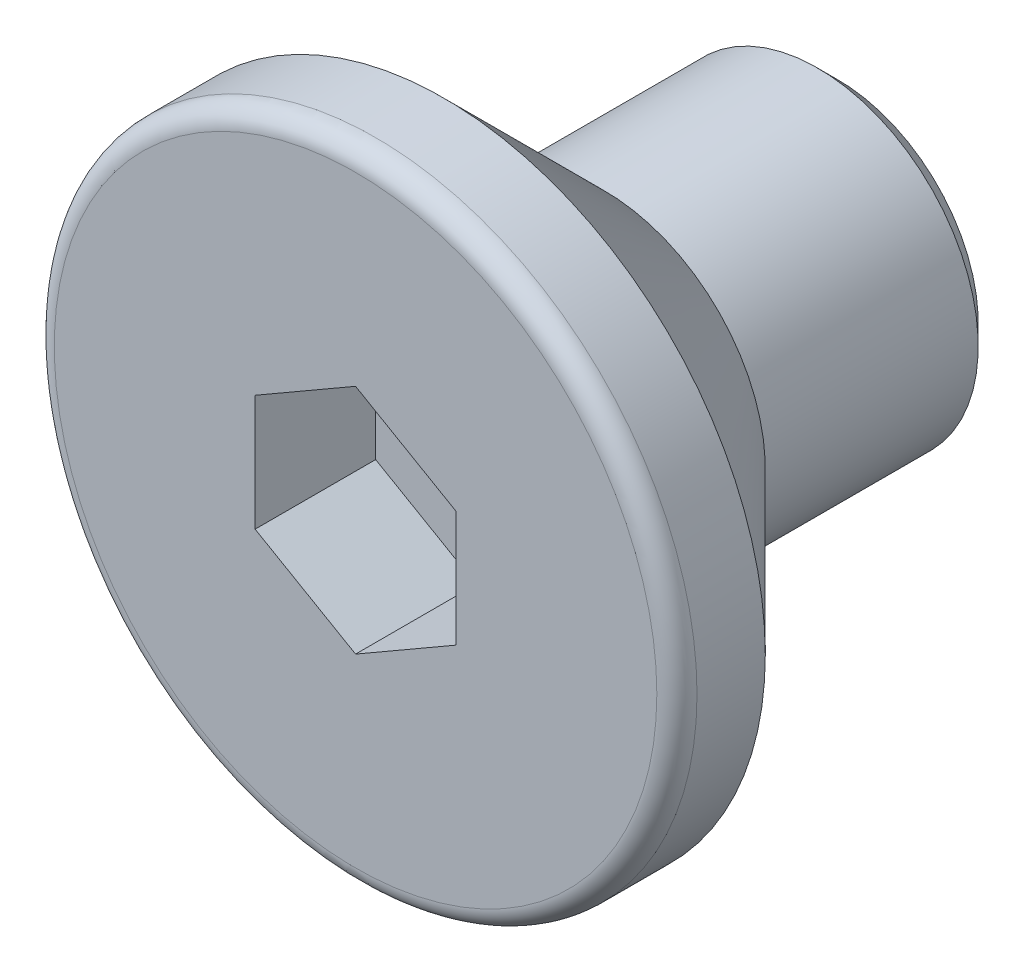
ISO-10303-21;
HEADER;
FILE_DESCRIPTION(('STEP AP214'),'2;1');
FILE_NAME('part.step','',(''),(''),'','','');
FILE_SCHEMA(('AUTOMOTIVE_DESIGN { 1 0 10303 214 1 1 1 1 }'));
ENDSEC;
DATA;
#1=APPLICATION_CONTEXT('core data for automotive mechanical design processes');
#2=APPLICATION_PROTOCOL_DEFINITION('international standard','automotive_design',2000,#1);
#3=PRODUCT_CONTEXT('',#1,'mechanical');
#4=PRODUCT('Part','Part','',(#3));
#5=PRODUCT_RELATED_PRODUCT_CATEGORY('part','',(#4));
#6=PRODUCT_DEFINITION_FORMATION('','',#4);
#7=PRODUCT_DEFINITION_CONTEXT('part definition',#1,'design');
#8=PRODUCT_DEFINITION('design','',#6,#7);
#9=PRODUCT_DEFINITION_SHAPE('','',#8);
#10=(LENGTH_UNIT() NAMED_UNIT(*) SI_UNIT(.MILLI.,.METRE.));
#11=(NAMED_UNIT(*) PLANE_ANGLE_UNIT() SI_UNIT($,.RADIAN.));
#12=(NAMED_UNIT(*) SI_UNIT($,.STERADIAN.) SOLID_ANGLE_UNIT());
#13=UNCERTAINTY_MEASURE_WITH_UNIT(LENGTH_MEASURE(1.E-05),#10,'distance_accuracy_value','');
#14=(GEOMETRIC_REPRESENTATION_CONTEXT(3) GLOBAL_UNCERTAINTY_ASSIGNED_CONTEXT((#13)) GLOBAL_UNIT_ASSIGNED_CONTEXT((#10,
#11,#12)) REPRESENTATION_CONTEXT('',''));
#15=CARTESIAN_POINT('',(0.,0.,0.));
#16=DIRECTION('',(0.,0.,1.));
#17=DIRECTION('',(1.,0.,0.));
#18=AXIS2_PLACEMENT_3D('',#15,#16,#17);
#19=CARTESIAN_POINT('',(0.,0.,6.));
#20=DIRECTION('',(0.,0.,1.));
#21=DIRECTION('',(1.,0.,0.));
#22=AXIS2_PLACEMENT_3D('',#19,#20,#21);
#23=PLANE('',#22);
#24=CARTESIAN_POINT('',(0.,0.,6.));
#25=DIRECTION('',(0.,0.,1.));
#26=DIRECTION('',(1.,0.,0.));
#27=AXIS2_PLACEMENT_3D('',#24,#25,#26);
#28=CIRCLE('',#27,7.5);
#29=CARTESIAN_POINT('',(7.5,0.,6.));
#30=VERTEX_POINT('',#29);
#31=EDGE_CURVE('E154',#30,#30,#28,.T.);
#32=ORIENTED_EDGE('',*,*,#31,.T.);
#33=EDGE_LOOP('',(#32));
#34=FACE_BOUND('',#33,.T.);
#35=DIRECTION('',(-0.866025403784439,0.5,0.));
#36=VECTOR('',#35,1.);
#37=CARTESIAN_POINT('',(2.5,1.44337567297407,6.));
#38=LINE('',#37,#36);
#39=CARTESIAN_POINT('',(2.5,1.44337567297407,6.));
#40=VERTEX_POINT('',#39);
#41=CARTESIAN_POINT('',(0.,2.88675134594813,6.));
#42=VERTEX_POINT('',#41);
#43=EDGE_CURVE('E53',#40,#42,#38,.T.);
#44=ORIENTED_EDGE('',*,*,#43,.F.);
#45=DIRECTION('',(0.,1.,0.));
#46=VECTOR('',#45,1.);
#47=CARTESIAN_POINT('',(2.5,-1.44337567297406,6.));
#48=LINE('',#47,#46);
#49=CARTESIAN_POINT('',(2.5,-1.44337567297406,6.));
#50=VERTEX_POINT('',#49);
#51=EDGE_CURVE('E136',#50,#40,#48,.T.);
#52=ORIENTED_EDGE('',*,*,#51,.F.);
#53=DIRECTION('',(0.866025403784439,0.5,0.));
#54=VECTOR('',#53,1.);
#55=CARTESIAN_POINT('',(0.,-2.88675134594813,6.));
#56=LINE('',#55,#54);
#57=CARTESIAN_POINT('',(0.,-2.88675134594813,6.));
#58=VERTEX_POINT('',#57);
#59=EDGE_CURVE('E134',#58,#50,#56,.T.);
#60=ORIENTED_EDGE('',*,*,#59,.F.);
#61=DIRECTION('',(0.866025403784439,-0.5,0.));
#62=VECTOR('',#61,1.);
#63=CARTESIAN_POINT('',(-2.5,-1.44337567297406,6.));
#64=LINE('',#63,#62);
#65=CARTESIAN_POINT('',(-2.5,-1.44337567297406,6.));
#66=VERTEX_POINT('',#65);
#67=EDGE_CURVE('E101',#66,#58,#64,.T.);
#68=ORIENTED_EDGE('',*,*,#67,.F.);
#69=DIRECTION('',(0.,-1.,0.));
#70=VECTOR('',#69,1.);
#71=CARTESIAN_POINT('',(-2.5,1.44337567297407,6.));
#72=LINE('',#71,#70);
#73=CARTESIAN_POINT('',(-2.5,1.44337567297407,6.));
#74=VERTEX_POINT('',#73);
#75=EDGE_CURVE('E130',#74,#66,#72,.T.);
#76=ORIENTED_EDGE('',*,*,#75,.F.);
#77=DIRECTION('',(-0.866025403784439,-0.5,0.));
#78=VECTOR('',#77,1.);
#79=CARTESIAN_POINT('',(0.,2.88675134594813,6.));
#80=LINE('',#79,#78);
#81=EDGE_CURVE('E127',#42,#74,#80,.T.);
#82=ORIENTED_EDGE('',*,*,#81,.F.);
#83=EDGE_LOOP('',(#44,#52,#60,#68,#76,#82));
#84=FACE_BOUND('',#83,.T.);
#85=ADVANCED_FACE('F37',(#34,#84),#23,.T.);
#86=CARTESIAN_POINT('',(0.,0.,-6.));
#87=DIRECTION('',(0.,0.,-1.));
#88=DIRECTION('',(-1.,0.,0.));
#89=AXIS2_PLACEMENT_3D('',#86,#87,#88);
#90=CYLINDRICAL_SURFACE('',#89,8.);
#91=CARTESIAN_POINT('',(0.,0.,5.5));
#92=DIRECTION('',(0.,0.,1.));
#93=DIRECTION('',(1.,0.,0.));
#94=AXIS2_PLACEMENT_3D('',#91,#92,#93);
#95=CIRCLE('',#94,8.);
#96=CARTESIAN_POINT('',(8.,0.,5.5));
#97=VERTEX_POINT('',#96);
#98=EDGE_CURVE('E151',#97,#97,#95,.F.);
#99=ORIENTED_EDGE('',*,*,#98,.T.);
#100=EDGE_LOOP('',(#99));
#101=FACE_BOUND('',#100,.T.);
#102=CARTESIAN_POINT('',(0.,0.,3.79999999999999));
#103=DIRECTION('',(0.,0.,-1.));
#104=DIRECTION('',(-1.,0.,0.));
#105=AXIS2_PLACEMENT_3D('',#102,#103,#104);
#106=CIRCLE('',#105,8.);
#107=CARTESIAN_POINT('',(-8.,0.,3.79999999999999));
#108=VERTEX_POINT('',#107);
#109=EDGE_CURVE('E148',#108,#108,#106,.T.);
#110=ORIENTED_EDGE('',*,*,#109,.F.);
#111=EDGE_LOOP('',(#110));
#112=FACE_BOUND('',#111,.T.);
#113=ADVANCED_FACE('F170',(#101,#112),#90,.T.);
#114=CARTESIAN_POINT('',(0.,0.,-0.2));
#115=DIRECTION('',(0.,0.,1.));
#116=DIRECTION('',(1.,0.,0.));
#117=AXIS2_PLACEMENT_3D('',#114,#115,#116);
#118=CONICAL_SURFACE('',#117,4.,0.78539816339745);
#119=ORIENTED_EDGE('',*,*,#109,.T.);
#120=EDGE_LOOP('',(#119));
#121=FACE_BOUND('',#120,.T.);
#122=CARTESIAN_POINT('',(0.,0.,-0.2));
#123=DIRECTION('',(0.,0.,-1.));
#124=DIRECTION('',(-1.,0.,0.));
#125=AXIS2_PLACEMENT_3D('',#122,#123,#124);
#126=CIRCLE('',#125,4.);
#127=CARTESIAN_POINT('',(-4.,0.,-0.2));
#128=VERTEX_POINT('',#127);
#129=EDGE_CURVE('E140',#128,#128,#126,.T.);
#130=ORIENTED_EDGE('',*,*,#129,.F.);
#131=EDGE_LOOP('',(#130));
#132=FACE_BOUND('',#131,.T.);
#133=ADVANCED_FACE('F176',(#121,#132),#118,.T.);
#134=CARTESIAN_POINT('',(0.,0.,-6.));
#135=DIRECTION('',(0.,0.,-1.));
#136=DIRECTION('',(-1.,0.,0.));
#137=AXIS2_PLACEMENT_3D('',#134,#135,#136);
#138=CYLINDRICAL_SURFACE('',#137,4.);
#139=CARTESIAN_POINT('',(0.,0.,-5.5));
#140=DIRECTION('',(0.,0.,-1.));
#141=DIRECTION('',(-1.,0.,0.));
#142=AXIS2_PLACEMENT_3D('',#139,#140,#141);
#143=CIRCLE('',#142,4.);
#144=CARTESIAN_POINT('',(-4.,0.,-5.5));
#145=VERTEX_POINT('',#144);
#146=EDGE_CURVE('E11',#145,#145,#143,.F.);
#147=ORIENTED_EDGE('',*,*,#146,.T.);
#148=EDGE_LOOP('',(#147));
#149=FACE_BOUND('',#148,.T.);
#150=ORIENTED_EDGE('',*,*,#129,.T.);
#151=EDGE_LOOP('',(#150));
#152=FACE_BOUND('',#151,.T.);
#153=ADVANCED_FACE('F183',(#149,#152),#138,.T.);
#154=CARTESIAN_POINT('',(0.,4.,-6.));
#155=DIRECTION('',(0.,0.,-1.));
#156=DIRECTION('',(-1.,0.,0.));
#157=AXIS2_PLACEMENT_3D('',#154,#155,#156);
#158=PLANE('',#157);
#159=CARTESIAN_POINT('',(0.,0.,-6.));
#160=DIRECTION('',(0.,0.,-1.));
#161=DIRECTION('',(-1.,0.,0.));
#162=AXIS2_PLACEMENT_3D('',#159,#160,#161);
#163=CIRCLE('',#162,3.5);
#164=CARTESIAN_POINT('',(-3.5,0.,-6.));
#165=VERTEX_POINT('',#164);
#166=EDGE_CURVE('E46',#165,#165,#163,.T.);
#167=ORIENTED_EDGE('',*,*,#166,.T.);
#168=EDGE_LOOP('',(#167));
#169=FACE_BOUND('',#168,.T.);
#170=ADVANCED_FACE('F159',(#169),#158,.T.);
#171=CARTESIAN_POINT('',(2.5,1.44337567297407,3.));
#172=DIRECTION('',(0.5,0.866025403784439,0.));
#173=DIRECTION('',(-0.866025403784439,0.5,0.));
#174=AXIS2_PLACEMENT_3D('',#171,#172,#173);
#175=PLANE('',#174);
#176=ORIENTED_EDGE('',*,*,#43,.T.);
#177=DIRECTION('',(0.,0.,1.));
#178=VECTOR('',#177,1.);
#179=CARTESIAN_POINT('',(0.,2.88675134594813,3.));
#180=LINE('',#179,#178);
#181=CARTESIAN_POINT('',(0.,2.88675134594813,3.));
#182=VERTEX_POINT('',#181);
#183=EDGE_CURVE('E83',#182,#42,#180,.T.);
#184=ORIENTED_EDGE('',*,*,#183,.F.);
#185=DIRECTION('',(-0.866025403784439,0.5,0.));
#186=VECTOR('',#185,1.);
#187=CARTESIAN_POINT('',(2.5,1.44337567297407,3.));
#188=LINE('',#187,#186);
#189=CARTESIAN_POINT('',(2.5,1.44337567297407,3.));
#190=VERTEX_POINT('',#189);
#191=EDGE_CURVE('E138',#190,#182,#188,.T.);
#192=ORIENTED_EDGE('',*,*,#191,.F.);
#193=DIRECTION('',(0.,0.,1.));
#194=VECTOR('',#193,1.);
#195=CARTESIAN_POINT('',(2.5,1.44337567297407,3.));
#196=LINE('',#195,#194);
#197=EDGE_CURVE('E61',#190,#40,#196,.T.);
#198=ORIENTED_EDGE('',*,*,#197,.T.);
#199=EDGE_LOOP('',(#176,#184,#192,#198));
#200=FACE_BOUND('',#199,.T.);
#201=ADVANCED_FACE('F190',(#200),#175,.F.);
#202=CARTESIAN_POINT('',(2.5,-1.44337567297406,3.));
#203=DIRECTION('',(1.,0.,0.));
#204=DIRECTION('',(0.,1.,0.));
#205=AXIS2_PLACEMENT_3D('',#202,#203,#204);
#206=PLANE('',#205);
#207=ORIENTED_EDGE('',*,*,#51,.T.);
#208=ORIENTED_EDGE('',*,*,#197,.F.);
#209=DIRECTION('',(0.,1.,0.));
#210=VECTOR('',#209,1.);
#211=CARTESIAN_POINT('',(2.5,-1.44337567297406,3.));
#212=LINE('',#211,#210);
#213=CARTESIAN_POINT('',(2.5,-1.44337567297406,3.));
#214=VERTEX_POINT('',#213);
#215=EDGE_CURVE('E113',#214,#190,#212,.T.);
#216=ORIENTED_EDGE('',*,*,#215,.F.);
#217=DIRECTION('',(0.,0.,1.));
#218=VECTOR('',#217,1.);
#219=CARTESIAN_POINT('',(2.5,-1.44337567297406,3.));
#220=LINE('',#219,#218);
#221=EDGE_CURVE('E105',#214,#50,#220,.T.);
#222=ORIENTED_EDGE('',*,*,#221,.T.);
#223=EDGE_LOOP('',(#207,#208,#216,#222));
#224=FACE_BOUND('',#223,.T.);
#225=ADVANCED_FACE('F193',(#224),#206,.F.);
#226=CARTESIAN_POINT('',(0.,-2.88675134594813,3.));
#227=DIRECTION('',(0.5,-0.866025403784439,0.));
#228=DIRECTION('',(0.866025403784439,0.5,0.));
#229=AXIS2_PLACEMENT_3D('',#226,#227,#228);
#230=PLANE('',#229);
#231=ORIENTED_EDGE('',*,*,#59,.T.);
#232=ORIENTED_EDGE('',*,*,#221,.F.);
#233=DIRECTION('',(0.866025403784439,0.5,0.));
#234=VECTOR('',#233,1.);
#235=CARTESIAN_POINT('',(0.,-2.88675134594813,3.));
#236=LINE('',#235,#234);
#237=CARTESIAN_POINT('',(0.,-2.88675134594813,3.));
#238=VERTEX_POINT('',#237);
#239=EDGE_CURVE('E109',#238,#214,#236,.T.);
#240=ORIENTED_EDGE('',*,*,#239,.F.);
#241=DIRECTION('',(0.,0.,1.));
#242=VECTOR('',#241,1.);
#243=CARTESIAN_POINT('',(0.,-2.88675134594813,3.));
#244=LINE('',#243,#242);
#245=EDGE_CURVE('E94',#238,#58,#244,.T.);
#246=ORIENTED_EDGE('',*,*,#245,.T.);
#247=EDGE_LOOP('',(#231,#232,#240,#246));
#248=FACE_BOUND('',#247,.T.);
#249=ADVANCED_FACE('F110',(#248),#230,.F.);
#250=CARTESIAN_POINT('',(-2.5,-1.44337567297406,3.));
#251=DIRECTION('',(-0.5,-0.866025403784438,0.));
#252=DIRECTION('',(0.866025403784439,-0.5,0.));
#253=AXIS2_PLACEMENT_3D('',#250,#251,#252);
#254=PLANE('',#253);
#255=ORIENTED_EDGE('',*,*,#67,.T.);
#256=ORIENTED_EDGE('',*,*,#245,.F.);
#257=DIRECTION('',(0.866025403784439,-0.5,0.));
#258=VECTOR('',#257,1.);
#259=CARTESIAN_POINT('',(-2.5,-1.44337567297406,3.));
#260=LINE('',#259,#258);
#261=CARTESIAN_POINT('',(-2.5,-1.44337567297406,3.));
#262=VERTEX_POINT('',#261);
#263=EDGE_CURVE('E98',#262,#238,#260,.T.);
#264=ORIENTED_EDGE('',*,*,#263,.F.);
#265=DIRECTION('',(0.,0.,1.));
#266=VECTOR('',#265,1.);
#267=CARTESIAN_POINT('',(-2.5,-1.44337567297406,3.));
#268=LINE('',#267,#266);
#269=EDGE_CURVE('E106',#262,#66,#268,.T.);
#270=ORIENTED_EDGE('',*,*,#269,.T.);
#271=EDGE_LOOP('',(#255,#256,#264,#270));
#272=FACE_BOUND('',#271,.T.);
#273=ADVANCED_FACE('F96',(#272),#254,.F.);
#274=CARTESIAN_POINT('',(-2.5,1.44337567297407,3.));
#275=DIRECTION('',(-1.,0.,0.));
#276=DIRECTION('',(0.,0.,1.));
#277=AXIS2_PLACEMENT_3D('',#274,#275,#276);
#278=PLANE('',#277);
#279=ORIENTED_EDGE('',*,*,#75,.T.);
#280=ORIENTED_EDGE('',*,*,#269,.F.);
#281=DIRECTION('',(0.,-1.,0.));
#282=VECTOR('',#281,1.);
#283=CARTESIAN_POINT('',(-2.5,1.44337567297407,3.));
#284=LINE('',#283,#282);
#285=CARTESIAN_POINT('',(-2.5,1.44337567297407,3.));
#286=VERTEX_POINT('',#285);
#287=EDGE_CURVE('E119',#286,#262,#284,.T.);
#288=ORIENTED_EDGE('',*,*,#287,.F.);
#289=DIRECTION('',(0.,0.,1.));
#290=VECTOR('',#289,1.);
#291=CARTESIAN_POINT('',(-2.5,1.44337567297407,3.));
#292=LINE('',#291,#290);
#293=EDGE_CURVE('E143',#286,#74,#292,.T.);
#294=ORIENTED_EDGE('',*,*,#293,.T.);
#295=EDGE_LOOP('',(#279,#280,#288,#294));
#296=FACE_BOUND('',#295,.T.);
#297=ADVANCED_FACE('F197',(#296),#278,.F.);
#298=CARTESIAN_POINT('',(0.,2.88675134594813,3.));
#299=DIRECTION('',(-0.5,0.866025403784439,0.));
#300=DIRECTION('',(-0.866025403784439,-0.5,0.));
#301=AXIS2_PLACEMENT_3D('',#298,#299,#300);
#302=PLANE('',#301);
#303=ORIENTED_EDGE('',*,*,#81,.T.);
#304=ORIENTED_EDGE('',*,*,#293,.F.);
#305=DIRECTION('',(-0.866025403784439,-0.5,0.));
#306=VECTOR('',#305,1.);
#307=CARTESIAN_POINT('',(0.,2.88675134594813,3.));
#308=LINE('',#307,#306);
#309=EDGE_CURVE('E121',#182,#286,#308,.T.);
#310=ORIENTED_EDGE('',*,*,#309,.F.);
#311=ORIENTED_EDGE('',*,*,#183,.T.);
#312=EDGE_LOOP('',(#303,#304,#310,#311));
#313=FACE_BOUND('',#312,.T.);
#314=ADVANCED_FACE('F194',(#313),#302,.F.);
#315=CARTESIAN_POINT('',(0.,0.,3.));
#316=DIRECTION('',(0.,0.,1.));
#317=DIRECTION('',(1.,0.,0.));
#318=AXIS2_PLACEMENT_3D('',#315,#316,#317);
#319=PLANE('',#318);
#320=ORIENTED_EDGE('',*,*,#191,.T.);
#321=ORIENTED_EDGE('',*,*,#309,.T.);
#322=ORIENTED_EDGE('',*,*,#287,.T.);
#323=ORIENTED_EDGE('',*,*,#263,.T.);
#324=ORIENTED_EDGE('',*,*,#239,.T.);
#325=ORIENTED_EDGE('',*,*,#215,.T.);
#326=EDGE_LOOP('',(#320,#321,#322,#323,#324,#325));
#327=FACE_BOUND('',#326,.T.);
#328=ADVANCED_FACE('F116',(#327),#319,.T.);
#329=CARTESIAN_POINT('',(0.,0.,5.5));
#330=DIRECTION('',(0.,0.,1.));
#331=DIRECTION('',(1.,0.,0.));
#332=AXIS2_PLACEMENT_3D('',#329,#330,#331);
#333=TOROIDAL_SURFACE('',#332,7.5,0.5);
#334=ORIENTED_EDGE('',*,*,#31,.F.);
#335=EDGE_LOOP('',(#334));
#336=FACE_BOUND('',#335,.T.);
#337=ORIENTED_EDGE('',*,*,#98,.F.);
#338=EDGE_LOOP('',(#337));
#339=FACE_BOUND('',#338,.T.);
#340=ADVANCED_FACE('F162',(#336,#339),#333,.T.);
#341=CARTESIAN_POINT('',(0.,0.,-6.));
#342=DIRECTION('',(0.,0.,1.));
#343=DIRECTION('',(1.,0.,0.));
#344=AXIS2_PLACEMENT_3D('',#341,#342,#343);
#345=CONICAL_SURFACE('',#344,3.5,0.785398163397445);
#346=ORIENTED_EDGE('',*,*,#146,.F.);
#347=EDGE_LOOP('',(#346));
#348=FACE_BOUND('',#347,.T.);
#349=ORIENTED_EDGE('',*,*,#166,.F.);
#350=EDGE_LOOP('',(#349));
#351=FACE_BOUND('',#350,.T.);
#352=ADVANCED_FACE('F40',(#348,#351),#345,.T.);
#353=CLOSED_SHELL('',(#85,#113,#133,#153,#170,#201,#225,#249,#273,#297,#314,#328,#340,#352));
#354=MANIFOLD_SOLID_BREP('B2',#353);
#355=ADVANCED_BREP_SHAPE_REPRESENTATION('',(#18,#354),#14);
#356=SHAPE_DEFINITION_REPRESENTATION(#9,#355);
ENDSEC;
END-ISO-10303-21;
